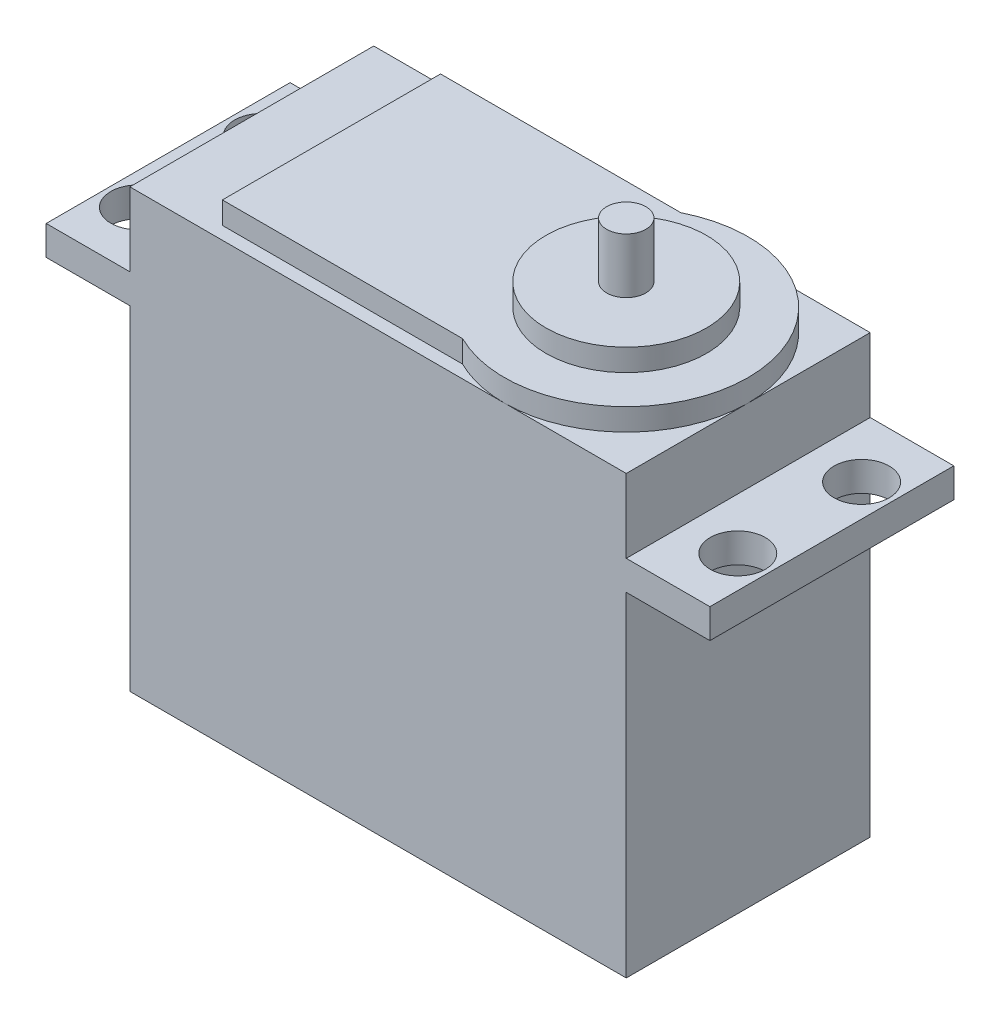
ISO-10303-21;
HEADER;
FILE_DESCRIPTION(('STEP AP214'),'2;1');
FILE_NAME('part.step','',(''),(''),'','','');
FILE_SCHEMA(('AUTOMOTIVE_DESIGN { 1 0 10303 214 1 1 1 1 }'));
ENDSEC;
DATA;
#1=APPLICATION_CONTEXT('core data for automotive mechanical design processes');
#2=APPLICATION_PROTOCOL_DEFINITION('international standard','automotive_design',2000,#1);
#3=PRODUCT_CONTEXT('',#1,'mechanical');
#4=PRODUCT('Part','Part','',(#3));
#5=PRODUCT_RELATED_PRODUCT_CATEGORY('part','',(#4));
#6=PRODUCT_DEFINITION_FORMATION('','',#4);
#7=PRODUCT_DEFINITION_CONTEXT('part definition',#1,'design');
#8=PRODUCT_DEFINITION('design','',#6,#7);
#9=PRODUCT_DEFINITION_SHAPE('','',#8);
#10=(LENGTH_UNIT() NAMED_UNIT(*) SI_UNIT(.MILLI.,.METRE.));
#11=(NAMED_UNIT(*) PLANE_ANGLE_UNIT() SI_UNIT($,.RADIAN.));
#12=(NAMED_UNIT(*) SI_UNIT($,.STERADIAN.) SOLID_ANGLE_UNIT());
#13=UNCERTAINTY_MEASURE_WITH_UNIT(LENGTH_MEASURE(1.E-05),#10,'distance_accuracy_value','');
#14=(GEOMETRIC_REPRESENTATION_CONTEXT(3) GLOBAL_UNCERTAINTY_ASSIGNED_CONTEXT((#13)) GLOBAL_UNIT_ASSIGNED_CONTEXT((#10,
#11,#12)) REPRESENTATION_CONTEXT('',''));
#15=CARTESIAN_POINT('',(0.,0.,0.));
#16=DIRECTION('',(0.,0.,1.));
#17=DIRECTION('',(1.,0.,0.));
#18=AXIS2_PLACEMENT_3D('',#15,#16,#17);
#19=CARTESIAN_POINT('',(0.,36.65,0.));
#20=DIRECTION('',(0.,1.,0.));
#21=DIRECTION('',(0.,0.,1.));
#22=AXIS2_PLACEMENT_3D('',#19,#20,#21);
#23=PLANE('',#22);
#24=DIRECTION('',(1.,0.,0.));
#25=VECTOR('',#24,1.);
#26=CARTESIAN_POINT('',(0.,36.65,8.9));
#27=LINE('',#26,#25);
#28=CARTESIAN_POINT('',(-13.75,36.65,8.9));
#29=VERTEX_POINT('',#28);
#30=CARTESIAN_POINT('',(5.85112373739166,36.65,8.9));
#31=VERTEX_POINT('',#30);
#32=EDGE_CURVE('E205',#29,#31,#27,.T.);
#33=ORIENTED_EDGE('',*,*,#32,.F.);
#34=DIRECTION('',(0.,0.,1.));
#35=VECTOR('',#34,1.);
#36=CARTESIAN_POINT('',(-13.75,36.65,0.));
#37=LINE('',#36,#35);
#38=CARTESIAN_POINT('',(-13.75,36.65,-8.9));
#39=VERTEX_POINT('',#38);
#40=EDGE_CURVE('E202',#39,#29,#37,.T.);
#41=ORIENTED_EDGE('',*,*,#40,.F.);
#42=DIRECTION('',(1.,0.,0.));
#43=VECTOR('',#42,1.);
#44=CARTESIAN_POINT('',(0.,36.65,-8.9));
#45=LINE('',#44,#43);
#46=CARTESIAN_POINT('',(5.85112373739166,36.65,-8.9));
#47=VERTEX_POINT('',#46);
#48=EDGE_CURVE('E367',#39,#47,#45,.T.);
#49=ORIENTED_EDGE('',*,*,#48,.T.);
#50=CARTESIAN_POINT('',(10.3,36.65,0.));
#51=DIRECTION('',(0.,1.,0.));
#52=DIRECTION('',(0.,0.,1.));
#53=AXIS2_PLACEMENT_3D('',#50,#51,#52);
#54=CIRCLE('',#53,9.95);
#55=CARTESIAN_POINT('',(10.3,36.65,-9.95));
#56=VERTEX_POINT('',#55);
#57=EDGE_CURVE('E294',#56,#47,#54,.T.);
#58=ORIENTED_EDGE('',*,*,#57,.F.);
#59=DIRECTION('',(-1.,0.,0.));
#60=VECTOR('',#59,1.);
#61=CARTESIAN_POINT('',(0.,36.65,-9.95));
#62=LINE('',#61,#60);
#63=CARTESIAN_POINT('',(-20.25,36.65,-9.95));
#64=VERTEX_POINT('',#63);
#65=EDGE_CURVE('E219',#56,#64,#62,.T.);
#66=ORIENTED_EDGE('',*,*,#65,.T.);
#67=DIRECTION('',(0.,0.,1.));
#68=VECTOR('',#67,1.);
#69=CARTESIAN_POINT('',(-20.25,36.65,0.));
#70=LINE('',#69,#68);
#71=CARTESIAN_POINT('',(-20.25,36.65,9.95));
#72=VERTEX_POINT('',#71);
#73=EDGE_CURVE('E218',#64,#72,#70,.T.);
#74=ORIENTED_EDGE('',*,*,#73,.T.);
#75=DIRECTION('',(1.,0.,0.));
#76=VECTOR('',#75,1.);
#77=CARTESIAN_POINT('',(0.,36.65,9.95));
#78=LINE('',#77,#76);
#79=CARTESIAN_POINT('',(10.3,36.65,9.95));
#80=VERTEX_POINT('',#79);
#81=EDGE_CURVE('E222',#72,#80,#78,.T.);
#82=ORIENTED_EDGE('',*,*,#81,.T.);
#83=EDGE_CURVE('E365',#31,#80,#54,.T.);
#84=ORIENTED_EDGE('',*,*,#83,.F.);
#85=EDGE_LOOP('',(#33,#41,#49,#58,#66,#74,#82,#84));
#86=FACE_BOUND('',#85,.T.);
#87=ADVANCED_FACE('F43',(#86),#23,.T.);
#88=CARTESIAN_POINT('',(20.25,36.65,0.));
#89=VERTEX_POINT('',#88);
#90=EDGE_CURVE('E355',#80,#89,#54,.T.);
#91=ORIENTED_EDGE('',*,*,#90,.F.);
#92=CARTESIAN_POINT('',(20.25,36.65,9.95));
#93=VERTEX_POINT('',#92);
#94=EDGE_CURVE('E221',#80,#93,#78,.T.);
#95=ORIENTED_EDGE('',*,*,#94,.T.);
#96=DIRECTION('',(0.,0.,-1.));
#97=VECTOR('',#96,1.);
#98=CARTESIAN_POINT('',(20.25,36.65,0.));
#99=LINE('',#98,#97);
#100=EDGE_CURVE('E226',#93,#89,#99,.T.);
#101=ORIENTED_EDGE('',*,*,#100,.T.);
#102=EDGE_LOOP('',(#91,#95,#101));
#103=FACE_BOUND('',#102,.T.);
#104=ADVANCED_FACE('F384',(#103),#23,.T.);
#105=CARTESIAN_POINT('',(0.,30.65,0.));
#106=DIRECTION('',(0.,-1.,0.));
#107=DIRECTION('',(0.,0.,-1.));
#108=AXIS2_PLACEMENT_3D('',#105,#106,#107);
#109=PLANE('',#108);
#110=CARTESIAN_POINT('',(24.45,30.65,-5.05));
#111=DIRECTION('',(0.,1.,0.));
#112=DIRECTION('',(0.,0.,1.));
#113=AXIS2_PLACEMENT_3D('',#110,#111,#112);
#114=CIRCLE('',#113,2.25);
#115=CARTESIAN_POINT('',(24.45,30.65,-2.8));
#116=VERTEX_POINT('',#115);
#117=EDGE_CURVE('E344',#116,#116,#114,.T.);
#118=ORIENTED_EDGE('',*,*,#117,.F.);
#119=EDGE_LOOP('',(#118));
#120=FACE_BOUND('',#119,.T.);
#121=CARTESIAN_POINT('',(24.45,30.65,5.05));
#122=DIRECTION('',(0.,1.,0.));
#123=DIRECTION('',(0.,0.,1.));
#124=AXIS2_PLACEMENT_3D('',#121,#122,#123);
#125=CIRCLE('',#124,2.25);
#126=CARTESIAN_POINT('',(24.45,30.65,7.3));
#127=VERTEX_POINT('',#126);
#128=EDGE_CURVE('E299',#127,#127,#125,.T.);
#129=ORIENTED_EDGE('',*,*,#128,.F.);
#130=EDGE_LOOP('',(#129));
#131=FACE_BOUND('',#130,.T.);
#132=DIRECTION('',(0.,0.,-1.));
#133=VECTOR('',#132,1.);
#134=CARTESIAN_POINT('',(20.25,30.65,0.));
#135=LINE('',#134,#133);
#136=CARTESIAN_POINT('',(20.25,30.65,9.95));
#137=VERTEX_POINT('',#136);
#138=CARTESIAN_POINT('',(20.25,30.65,-9.95));
#139=VERTEX_POINT('',#138);
#140=EDGE_CURVE('E209',#137,#139,#135,.T.);
#141=ORIENTED_EDGE('',*,*,#140,.F.);
#142=DIRECTION('',(1.,0.,0.));
#143=VECTOR('',#142,1.);
#144=CARTESIAN_POINT('',(-27.075,30.65,9.95));
#145=LINE('',#144,#143);
#146=CARTESIAN_POINT('',(27.075,30.65,9.95));
#147=VERTEX_POINT('',#146);
#148=EDGE_CURVE('E253',#137,#147,#145,.T.);
#149=ORIENTED_EDGE('',*,*,#148,.T.);
#150=DIRECTION('',(0.,0.,-1.));
#151=VECTOR('',#150,1.);
#152=CARTESIAN_POINT('',(27.075,30.65,9.95));
#153=LINE('',#152,#151);
#154=CARTESIAN_POINT('',(27.075,30.65,-9.95));
#155=VERTEX_POINT('',#154);
#156=EDGE_CURVE('E244',#147,#155,#153,.T.);
#157=ORIENTED_EDGE('',*,*,#156,.T.);
#158=DIRECTION('',(-1.,0.,0.));
#159=VECTOR('',#158,1.);
#160=CARTESIAN_POINT('',(-27.075,30.65,-9.95));
#161=LINE('',#160,#159);
#162=EDGE_CURVE('E249',#155,#139,#161,.T.);
#163=ORIENTED_EDGE('',*,*,#162,.T.);
#164=EDGE_LOOP('',(#141,#149,#157,#163));
#165=FACE_BOUND('',#164,.T.);
#166=ADVANCED_FACE('F430',(#120,#131,#165),#109,.F.);
#167=CARTESIAN_POINT('',(-24.45,30.65,5.05));
#168=DIRECTION('',(0.,1.,0.));
#169=DIRECTION('',(0.,0.,1.));
#170=AXIS2_PLACEMENT_3D('',#167,#168,#169);
#171=CIRCLE('',#170,2.25);
#172=CARTESIAN_POINT('',(-24.45,30.65,7.3));
#173=VERTEX_POINT('',#172);
#174=EDGE_CURVE('E333',#173,#173,#171,.T.);
#175=ORIENTED_EDGE('',*,*,#174,.F.);
#176=EDGE_LOOP('',(#175));
#177=FACE_BOUND('',#176,.T.);
#178=CARTESIAN_POINT('',(-24.45,30.65,-5.05));
#179=DIRECTION('',(0.,1.,0.));
#180=DIRECTION('',(0.,0.,1.));
#181=AXIS2_PLACEMENT_3D('',#178,#179,#180);
#182=CIRCLE('',#181,2.25);
#183=CARTESIAN_POINT('',(-24.45,30.65,-2.8));
#184=VERTEX_POINT('',#183);
#185=EDGE_CURVE('E339',#184,#184,#182,.T.);
#186=ORIENTED_EDGE('',*,*,#185,.F.);
#187=EDGE_LOOP('',(#186));
#188=FACE_BOUND('',#187,.T.);
#189=DIRECTION('',(0.,0.,1.));
#190=VECTOR('',#189,1.);
#191=CARTESIAN_POINT('',(-20.25,30.65,0.));
#192=LINE('',#191,#190);
#193=CARTESIAN_POINT('',(-20.25,30.65,-9.95));
#194=VERTEX_POINT('',#193);
#195=CARTESIAN_POINT('',(-20.25,30.65,9.95));
#196=VERTEX_POINT('',#195);
#197=EDGE_CURVE('E206',#194,#196,#192,.T.);
#198=ORIENTED_EDGE('',*,*,#197,.F.);
#199=CARTESIAN_POINT('',(-27.075,30.65,-9.95));
#200=VERTEX_POINT('',#199);
#201=EDGE_CURVE('E247',#194,#200,#161,.T.);
#202=ORIENTED_EDGE('',*,*,#201,.T.);
#203=DIRECTION('',(0.,0.,1.));
#204=VECTOR('',#203,1.);
#205=CARTESIAN_POINT('',(-27.075,30.65,9.95));
#206=LINE('',#205,#204);
#207=CARTESIAN_POINT('',(-27.075,30.65,9.95));
#208=VERTEX_POINT('',#207);
#209=EDGE_CURVE('E251',#200,#208,#206,.T.);
#210=ORIENTED_EDGE('',*,*,#209,.T.);
#211=EDGE_CURVE('E254',#208,#196,#145,.T.);
#212=ORIENTED_EDGE('',*,*,#211,.T.);
#213=EDGE_LOOP('',(#198,#202,#210,#212));
#214=FACE_BOUND('',#213,.T.);
#215=ADVANCED_FACE('F399',(#177,#188,#214),#109,.F.);
#216=CARTESIAN_POINT('',(20.25,28.25,9.95));
#217=DIRECTION('',(-1.,0.,0.));
#218=DIRECTION('',(0.,0.,1.));
#219=AXIS2_PLACEMENT_3D('',#216,#217,#218);
#220=PLANE('',#219);
#221=DIRECTION('',(0.,-1.,0.));
#222=VECTOR('',#221,1.);
#223=CARTESIAN_POINT('',(20.25,28.25,9.95));
#224=LINE('',#223,#222);
#225=CARTESIAN_POINT('',(20.25,28.25,9.95));
#226=VERTEX_POINT('',#225);
#227=CARTESIAN_POINT('',(20.25,1.,9.95));
#228=VERTEX_POINT('',#227);
#229=EDGE_CURVE('E285',#226,#228,#224,.T.);
#230=ORIENTED_EDGE('',*,*,#229,.T.);
#231=DIRECTION('',(0.,0.,-1.));
#232=VECTOR('',#231,1.);
#233=CARTESIAN_POINT('',(20.25,1.,-9.95));
#234=LINE('',#233,#232);
#235=CARTESIAN_POINT('',(20.25,1.,-9.95));
#236=VERTEX_POINT('',#235);
#237=EDGE_CURVE('E11',#228,#236,#234,.T.);
#238=ORIENTED_EDGE('',*,*,#237,.T.);
#239=DIRECTION('',(0.,-1.,0.));
#240=VECTOR('',#239,1.);
#241=CARTESIAN_POINT('',(20.25,28.25,-9.95));
#242=LINE('',#241,#240);
#243=CARTESIAN_POINT('',(20.25,28.25,-9.95));
#244=VERTEX_POINT('',#243);
#245=EDGE_CURVE('E291',#244,#236,#242,.T.);
#246=ORIENTED_EDGE('',*,*,#245,.F.);
#247=DIRECTION('',(0.,0.,-1.));
#248=VECTOR('',#247,1.);
#249=CARTESIAN_POINT('',(20.25,28.25,9.95));
#250=LINE('',#249,#248);
#251=EDGE_CURVE('E279',#226,#244,#250,.T.);
#252=ORIENTED_EDGE('',*,*,#251,.F.);
#253=EDGE_LOOP('',(#230,#238,#246,#252));
#254=FACE_BOUND('',#253,.T.);
#255=ADVANCED_FACE('F416',(#254),#220,.F.);
#256=CARTESIAN_POINT('',(-20.25,28.25,-9.95));
#257=DIRECTION('',(0.,0.,1.));
#258=DIRECTION('',(1.,0.,0.));
#259=AXIS2_PLACEMENT_3D('',#256,#257,#258);
#260=PLANE('',#259);
#261=ORIENTED_EDGE('',*,*,#245,.T.);
#262=DIRECTION('',(-1.,0.,0.));
#263=VECTOR('',#262,1.);
#264=CARTESIAN_POINT('',(-20.25,1.,-9.95));
#265=LINE('',#264,#263);
#266=CARTESIAN_POINT('',(-20.25,1.,-9.95));
#267=VERTEX_POINT('',#266);
#268=EDGE_CURVE('E309',#236,#267,#265,.T.);
#269=ORIENTED_EDGE('',*,*,#268,.T.);
#270=DIRECTION('',(0.,-1.,0.));
#271=VECTOR('',#270,1.);
#272=CARTESIAN_POINT('',(-20.25,28.25,-9.95));
#273=LINE('',#272,#271);
#274=CARTESIAN_POINT('',(-20.25,28.25,-9.95));
#275=VERTEX_POINT('',#274);
#276=EDGE_CURVE('E289',#275,#267,#273,.T.);
#277=ORIENTED_EDGE('',*,*,#276,.F.);
#278=DIRECTION('',(-1.,0.,0.));
#279=VECTOR('',#278,1.);
#280=CARTESIAN_POINT('',(-27.075,28.25,-9.95));
#281=LINE('',#280,#279);
#282=CARTESIAN_POINT('',(-27.075,28.25,-9.95));
#283=VERTEX_POINT('',#282);
#284=EDGE_CURVE('E259',#275,#283,#281,.T.);
#285=ORIENTED_EDGE('',*,*,#284,.T.);
#286=DIRECTION('',(0.,-1.,0.));
#287=VECTOR('',#286,1.);
#288=CARTESIAN_POINT('',(-27.075,30.65,-9.95));
#289=LINE('',#288,#287);
#290=EDGE_CURVE('E273',#200,#283,#289,.T.);
#291=ORIENTED_EDGE('',*,*,#290,.F.);
#292=ORIENTED_EDGE('',*,*,#201,.F.);
#293=DIRECTION('',(0.,-1.,0.));
#294=VECTOR('',#293,1.);
#295=CARTESIAN_POINT('',(-20.25,36.65,-9.95));
#296=LINE('',#295,#294);
#297=EDGE_CURVE('E240',#64,#194,#296,.T.);
#298=ORIENTED_EDGE('',*,*,#297,.F.);
#299=ORIENTED_EDGE('',*,*,#65,.F.);
#300=CARTESIAN_POINT('',(20.25,36.65,-9.95));
#301=VERTEX_POINT('',#300);
#302=EDGE_CURVE('E215',#301,#56,#62,.T.);
#303=ORIENTED_EDGE('',*,*,#302,.F.);
#304=DIRECTION('',(0.,-1.,0.));
#305=VECTOR('',#304,1.);
#306=CARTESIAN_POINT('',(20.25,36.65,-9.95));
#307=LINE('',#306,#305);
#308=EDGE_CURVE('E228',#301,#139,#307,.T.);
#309=ORIENTED_EDGE('',*,*,#308,.T.);
#310=ORIENTED_EDGE('',*,*,#162,.F.);
#311=DIRECTION('',(0.,-1.,0.));
#312=VECTOR('',#311,1.);
#313=CARTESIAN_POINT('',(27.075,30.65,-9.95));
#314=LINE('',#313,#312);
#315=CARTESIAN_POINT('',(27.075,28.25,-9.95));
#316=VERTEX_POINT('',#315);
#317=EDGE_CURVE('E276',#155,#316,#314,.T.);
#318=ORIENTED_EDGE('',*,*,#317,.T.);
#319=EDGE_CURVE('E260',#316,#244,#281,.T.);
#320=ORIENTED_EDGE('',*,*,#319,.T.);
#321=EDGE_LOOP('',(#261,#269,#277,#285,#291,#292,#298,#299,#303,#309,#310,#318,#320));
#322=FACE_BOUND('',#321,.T.);
#323=ADVANCED_FACE('F419',(#322),#260,.F.);
#324=CARTESIAN_POINT('',(-20.25,28.25,9.95));
#325=DIRECTION('',(1.,0.,0.));
#326=DIRECTION('',(0.,0.,-1.));
#327=AXIS2_PLACEMENT_3D('',#324,#325,#326);
#328=PLANE('',#327);
#329=ORIENTED_EDGE('',*,*,#276,.T.);
#330=DIRECTION('',(0.,0.,1.));
#331=VECTOR('',#330,1.);
#332=CARTESIAN_POINT('',(-20.25,1.,9.95));
#333=LINE('',#332,#331);
#334=CARTESIAN_POINT('',(-20.25,1.,9.95));
#335=VERTEX_POINT('',#334);
#336=EDGE_CURVE('E68',#267,#335,#333,.T.);
#337=ORIENTED_EDGE('',*,*,#336,.T.);
#338=DIRECTION('',(0.,-1.,0.));
#339=VECTOR('',#338,1.);
#340=CARTESIAN_POINT('',(-20.25,28.25,9.95));
#341=LINE('',#340,#339);
#342=CARTESIAN_POINT('',(-20.25,28.25,9.95));
#343=VERTEX_POINT('',#342);
#344=EDGE_CURVE('E287',#343,#335,#341,.T.);
#345=ORIENTED_EDGE('',*,*,#344,.F.);
#346=DIRECTION('',(0.,0.,1.));
#347=VECTOR('',#346,1.);
#348=CARTESIAN_POINT('',(-20.25,28.25,9.95));
#349=LINE('',#348,#347);
#350=EDGE_CURVE('E282',#275,#343,#349,.T.);
#351=ORIENTED_EDGE('',*,*,#350,.F.);
#352=EDGE_LOOP('',(#329,#337,#345,#351));
#353=FACE_BOUND('',#352,.T.);
#354=ADVANCED_FACE('F438',(#353),#328,.F.);
#355=CARTESIAN_POINT('',(-20.25,28.25,9.95));
#356=DIRECTION('',(0.,0.,-1.));
#357=DIRECTION('',(-1.,0.,0.));
#358=AXIS2_PLACEMENT_3D('',#355,#356,#357);
#359=PLANE('',#358);
#360=ORIENTED_EDGE('',*,*,#344,.T.);
#361=DIRECTION('',(1.,0.,0.));
#362=VECTOR('',#361,1.);
#363=CARTESIAN_POINT('',(20.25,1.,9.95));
#364=LINE('',#363,#362);
#365=EDGE_CURVE('E53',#335,#228,#364,.T.);
#366=ORIENTED_EDGE('',*,*,#365,.T.);
#367=ORIENTED_EDGE('',*,*,#229,.F.);
#368=DIRECTION('',(1.,0.,0.));
#369=VECTOR('',#368,1.);
#370=CARTESIAN_POINT('',(-27.075,28.25,9.95));
#371=LINE('',#370,#369);
#372=CARTESIAN_POINT('',(27.075,28.25,9.95));
#373=VERTEX_POINT('',#372);
#374=EDGE_CURVE('E265',#226,#373,#371,.T.);
#375=ORIENTED_EDGE('',*,*,#374,.T.);
#376=DIRECTION('',(0.,-1.,0.));
#377=VECTOR('',#376,1.);
#378=CARTESIAN_POINT('',(27.075,30.65,9.95));
#379=LINE('',#378,#377);
#380=EDGE_CURVE('E256',#147,#373,#379,.T.);
#381=ORIENTED_EDGE('',*,*,#380,.F.);
#382=ORIENTED_EDGE('',*,*,#148,.F.);
#383=DIRECTION('',(0.,-1.,0.));
#384=VECTOR('',#383,1.);
#385=CARTESIAN_POINT('',(20.25,36.65,9.95));
#386=LINE('',#385,#384);
#387=EDGE_CURVE('E234',#93,#137,#386,.T.);
#388=ORIENTED_EDGE('',*,*,#387,.F.);
#389=ORIENTED_EDGE('',*,*,#94,.F.);
#390=ORIENTED_EDGE('',*,*,#81,.F.);
#391=DIRECTION('',(0.,-1.,0.));
#392=VECTOR('',#391,1.);
#393=CARTESIAN_POINT('',(-20.25,36.65,9.95));
#394=LINE('',#393,#392);
#395=EDGE_CURVE('E237',#72,#196,#394,.T.);
#396=ORIENTED_EDGE('',*,*,#395,.T.);
#397=ORIENTED_EDGE('',*,*,#211,.F.);
#398=DIRECTION('',(0.,-1.,0.));
#399=VECTOR('',#398,1.);
#400=CARTESIAN_POINT('',(-27.075,30.65,9.95));
#401=LINE('',#400,#399);
#402=CARTESIAN_POINT('',(-27.075,28.25,9.95));
#403=VERTEX_POINT('',#402);
#404=EDGE_CURVE('E270',#208,#403,#401,.T.);
#405=ORIENTED_EDGE('',*,*,#404,.T.);
#406=EDGE_CURVE('E248',#403,#343,#371,.T.);
#407=ORIENTED_EDGE('',*,*,#406,.T.);
#408=EDGE_LOOP('',(#360,#366,#367,#375,#381,#382,#388,#389,#390,#396,#397,#405,#407));
#409=FACE_BOUND('',#408,.T.);
#410=ADVANCED_FACE('F388',(#409),#359,.F.);
#411=CARTESIAN_POINT('',(0.,0.,0.));
#412=DIRECTION('',(0.,-1.,0.));
#413=DIRECTION('',(0.,0.,-1.));
#414=AXIS2_PLACEMENT_3D('',#411,#412,#413);
#415=PLANE('',#414);
#416=DIRECTION('',(0.,0.,-1.));
#417=VECTOR('',#416,1.);
#418=CARTESIAN_POINT('',(-19.25,0.,-9.95));
#419=LINE('',#418,#417);
#420=CARTESIAN_POINT('',(-19.25,0.,8.94999999999998));
#421=VERTEX_POINT('',#420);
#422=CARTESIAN_POINT('',(-19.25,0.,-8.94999999999998));
#423=VERTEX_POINT('',#422);
#424=EDGE_CURVE('E317',#421,#423,#419,.T.);
#425=ORIENTED_EDGE('',*,*,#424,.T.);
#426=DIRECTION('',(1.,0.,0.));
#427=VECTOR('',#426,1.);
#428=CARTESIAN_POINT('',(20.25,0.,-8.94999999999998));
#429=LINE('',#428,#427);
#430=CARTESIAN_POINT('',(19.25,0.,-8.94999999999998));
#431=VERTEX_POINT('',#430);
#432=EDGE_CURVE('E319',#423,#431,#429,.T.);
#433=ORIENTED_EDGE('',*,*,#432,.T.);
#434=DIRECTION('',(0.,0.,1.));
#435=VECTOR('',#434,1.);
#436=CARTESIAN_POINT('',(19.25,0.,9.95));
#437=LINE('',#436,#435);
#438=CARTESIAN_POINT('',(19.25,0.,8.94999999999998));
#439=VERTEX_POINT('',#438);
#440=EDGE_CURVE('E312',#431,#439,#437,.T.);
#441=ORIENTED_EDGE('',*,*,#440,.T.);
#442=DIRECTION('',(-1.,0.,0.));
#443=VECTOR('',#442,1.);
#444=CARTESIAN_POINT('',(-20.25,0.,8.94999999999998));
#445=LINE('',#444,#443);
#446=EDGE_CURVE('E315',#439,#421,#445,.T.);
#447=ORIENTED_EDGE('',*,*,#446,.T.);
#448=EDGE_LOOP('',(#425,#433,#441,#447));
#449=FACE_BOUND('',#448,.T.);
#450=ADVANCED_FACE('F445',(#449),#415,.T.);
#451=CARTESIAN_POINT('',(0.,28.25,0.));
#452=DIRECTION('',(0.,-1.,0.));
#453=DIRECTION('',(0.,0.,-1.));
#454=AXIS2_PLACEMENT_3D('',#451,#452,#453);
#455=PLANE('',#454);
#456=CARTESIAN_POINT('',(24.45,28.25,-5.05));
#457=DIRECTION('',(0.,-1.,0.));
#458=DIRECTION('',(0.,0.,-1.));
#459=AXIS2_PLACEMENT_3D('',#456,#457,#458);
#460=CIRCLE('',#459,2.25);
#461=CARTESIAN_POINT('',(24.45,28.25,-7.3));
#462=VERTEX_POINT('',#461);
#463=EDGE_CURVE('E305',#462,#462,#460,.T.);
#464=ORIENTED_EDGE('',*,*,#463,.F.);
#465=EDGE_LOOP('',(#464));
#466=FACE_BOUND('',#465,.T.);
#467=CARTESIAN_POINT('',(24.45,28.25,5.05));
#468=DIRECTION('',(0.,-1.,0.));
#469=DIRECTION('',(0.,0.,-1.));
#470=AXIS2_PLACEMENT_3D('',#467,#468,#469);
#471=CIRCLE('',#470,2.25);
#472=CARTESIAN_POINT('',(24.45,28.25,2.8));
#473=VERTEX_POINT('',#472);
#474=EDGE_CURVE('E302',#473,#473,#471,.T.);
#475=ORIENTED_EDGE('',*,*,#474,.F.);
#476=EDGE_LOOP('',(#475));
#477=FACE_BOUND('',#476,.T.);
#478=ORIENTED_EDGE('',*,*,#374,.F.);
#479=ORIENTED_EDGE('',*,*,#251,.T.);
#480=ORIENTED_EDGE('',*,*,#319,.F.);
#481=DIRECTION('',(0.,0.,-1.));
#482=VECTOR('',#481,1.);
#483=CARTESIAN_POINT('',(27.075,28.25,9.95));
#484=LINE('',#483,#482);
#485=EDGE_CURVE('E243',#373,#316,#484,.T.);
#486=ORIENTED_EDGE('',*,*,#485,.F.);
#487=EDGE_LOOP('',(#478,#479,#480,#486));
#488=FACE_BOUND('',#487,.T.);
#489=ADVANCED_FACE('F424',(#466,#477,#488),#455,.T.);
#490=CARTESIAN_POINT('',(27.075,30.65,9.95));
#491=DIRECTION('',(-1.,0.,0.));
#492=DIRECTION('',(0.,0.,1.));
#493=AXIS2_PLACEMENT_3D('',#490,#491,#492);
#494=PLANE('',#493);
#495=ORIENTED_EDGE('',*,*,#485,.T.);
#496=ORIENTED_EDGE('',*,*,#317,.F.);
#497=ORIENTED_EDGE('',*,*,#156,.F.);
#498=ORIENTED_EDGE('',*,*,#380,.T.);
#499=EDGE_LOOP('',(#495,#496,#497,#498));
#500=FACE_BOUND('',#499,.T.);
#501=ADVANCED_FACE('F428',(#500),#494,.F.);
#502=CARTESIAN_POINT('',(-27.075,30.65,9.95));
#503=DIRECTION('',(1.,0.,0.));
#504=DIRECTION('',(0.,0.,-1.));
#505=AXIS2_PLACEMENT_3D('',#502,#503,#504);
#506=PLANE('',#505);
#507=DIRECTION('',(0.,0.,1.));
#508=VECTOR('',#507,1.);
#509=CARTESIAN_POINT('',(-27.075,28.25,9.95));
#510=LINE('',#509,#508);
#511=EDGE_CURVE('E263',#283,#403,#510,.T.);
#512=ORIENTED_EDGE('',*,*,#511,.T.);
#513=ORIENTED_EDGE('',*,*,#404,.F.);
#514=ORIENTED_EDGE('',*,*,#209,.F.);
#515=ORIENTED_EDGE('',*,*,#290,.T.);
#516=EDGE_LOOP('',(#512,#513,#514,#515));
#517=FACE_BOUND('',#516,.T.);
#518=ADVANCED_FACE('F404',(#517),#506,.F.);
#519=CARTESIAN_POINT('',(-24.45,28.25,5.05));
#520=DIRECTION('',(0.,-1.,0.));
#521=DIRECTION('',(0.,0.,-1.));
#522=AXIS2_PLACEMENT_3D('',#519,#520,#521);
#523=CIRCLE('',#522,2.25);
#524=CARTESIAN_POINT('',(-24.45,28.25,2.8));
#525=VERTEX_POINT('',#524);
#526=EDGE_CURVE('E298',#525,#525,#523,.T.);
#527=ORIENTED_EDGE('',*,*,#526,.F.);
#528=EDGE_LOOP('',(#527));
#529=FACE_BOUND('',#528,.T.);
#530=CARTESIAN_POINT('',(-24.45,28.25,-5.05));
#531=DIRECTION('',(0.,-1.,0.));
#532=DIRECTION('',(0.,0.,-1.));
#533=AXIS2_PLACEMENT_3D('',#530,#531,#532);
#534=CIRCLE('',#533,2.25);
#535=CARTESIAN_POINT('',(-24.45,28.25,-7.3));
#536=VERTEX_POINT('',#535);
#537=EDGE_CURVE('E295',#536,#536,#534,.T.);
#538=ORIENTED_EDGE('',*,*,#537,.F.);
#539=EDGE_LOOP('',(#538));
#540=FACE_BOUND('',#539,.T.);
#541=ORIENTED_EDGE('',*,*,#284,.F.);
#542=ORIENTED_EDGE('',*,*,#350,.T.);
#543=ORIENTED_EDGE('',*,*,#406,.F.);
#544=ORIENTED_EDGE('',*,*,#511,.F.);
#545=EDGE_LOOP('',(#541,#542,#543,#544));
#546=FACE_BOUND('',#545,.T.);
#547=ADVANCED_FACE('F408',(#529,#540,#546),#455,.T.);
#548=CARTESIAN_POINT('',(-20.25,36.65,0.));
#549=DIRECTION('',(1.,0.,0.));
#550=DIRECTION('',(0.,0.,-1.));
#551=AXIS2_PLACEMENT_3D('',#548,#549,#550);
#552=PLANE('',#551);
#553=ORIENTED_EDGE('',*,*,#197,.T.);
#554=ORIENTED_EDGE('',*,*,#395,.F.);
#555=ORIENTED_EDGE('',*,*,#73,.F.);
#556=ORIENTED_EDGE('',*,*,#297,.T.);
#557=EDGE_LOOP('',(#553,#554,#555,#556));
#558=FACE_BOUND('',#557,.T.);
#559=ADVANCED_FACE('F394',(#558),#552,.F.);
#560=CARTESIAN_POINT('',(20.25,36.65,0.));
#561=DIRECTION('',(-1.,0.,0.));
#562=DIRECTION('',(0.,0.,1.));
#563=AXIS2_PLACEMENT_3D('',#560,#561,#562);
#564=PLANE('',#563);
#565=ORIENTED_EDGE('',*,*,#140,.T.);
#566=ORIENTED_EDGE('',*,*,#308,.F.);
#567=EDGE_CURVE('E225',#89,#301,#99,.T.);
#568=ORIENTED_EDGE('',*,*,#567,.F.);
#569=ORIENTED_EDGE('',*,*,#100,.F.);
#570=ORIENTED_EDGE('',*,*,#387,.T.);
#571=EDGE_LOOP('',(#565,#566,#568,#569,#570));
#572=FACE_BOUND('',#571,.T.);
#573=ADVANCED_FACE('F432',(#572),#564,.F.);
#574=EDGE_CURVE('E381',#89,#56,#54,.T.);
#575=ORIENTED_EDGE('',*,*,#574,.F.);
#576=ORIENTED_EDGE('',*,*,#567,.T.);
#577=ORIENTED_EDGE('',*,*,#302,.T.);
#578=EDGE_LOOP('',(#575,#576,#577));
#579=FACE_BOUND('',#578,.T.);
#580=ADVANCED_FACE('F437',(#579),#23,.T.);
#581=CARTESIAN_POINT('',(0.,38.45,8.9));
#582=DIRECTION('',(0.,0.,-1.));
#583=DIRECTION('',(-1.,0.,0.));
#584=AXIS2_PLACEMENT_3D('',#581,#582,#583);
#585=PLANE('',#584);
#586=ORIENTED_EDGE('',*,*,#32,.T.);
#587=DIRECTION('',(0.,-1.,0.));
#588=VECTOR('',#587,1.);
#589=CARTESIAN_POINT('',(5.85112373739166,38.45,8.9));
#590=LINE('',#589,#588);
#591=CARTESIAN_POINT('',(5.85112373739166,38.45,8.9));
#592=VERTEX_POINT('',#591);
#593=EDGE_CURVE('E184',#592,#31,#590,.T.);
#594=ORIENTED_EDGE('',*,*,#593,.F.);
#595=DIRECTION('',(1.,0.,0.));
#596=VECTOR('',#595,1.);
#597=CARTESIAN_POINT('',(0.,38.45,8.9));
#598=LINE('',#597,#596);
#599=CARTESIAN_POINT('',(-13.75,38.45,8.9));
#600=VERTEX_POINT('',#599);
#601=EDGE_CURVE('E193',#600,#592,#598,.T.);
#602=ORIENTED_EDGE('',*,*,#601,.F.);
#603=DIRECTION('',(0.,-1.,0.));
#604=VECTOR('',#603,1.);
#605=CARTESIAN_POINT('',(-13.75,38.45,8.9));
#606=LINE('',#605,#604);
#607=EDGE_CURVE('E363',#600,#29,#606,.T.);
#608=ORIENTED_EDGE('',*,*,#607,.T.);
#609=EDGE_LOOP('',(#586,#594,#602,#608));
#610=FACE_BOUND('',#609,.T.);
#611=ADVANCED_FACE('F204',(#610),#585,.F.);
#612=CARTESIAN_POINT('',(10.3,38.45,0.));
#613=DIRECTION('',(0.,-1.,0.));
#614=DIRECTION('',(0.,0.,-1.));
#615=AXIS2_PLACEMENT_3D('',#612,#613,#614);
#616=CYLINDRICAL_SURFACE('',#615,9.95);
#617=ORIENTED_EDGE('',*,*,#83,.T.);
#618=ORIENTED_EDGE('',*,*,#90,.T.);
#619=ORIENTED_EDGE('',*,*,#574,.T.);
#620=ORIENTED_EDGE('',*,*,#57,.T.);
#621=DIRECTION('',(0.,-1.,0.));
#622=VECTOR('',#621,1.);
#623=CARTESIAN_POINT('',(5.85112373739166,38.45,-8.9));
#624=LINE('',#623,#622);
#625=CARTESIAN_POINT('',(5.85112373739166,38.45,-8.9));
#626=VERTEX_POINT('',#625);
#627=EDGE_CURVE('E188',#626,#47,#624,.T.);
#628=ORIENTED_EDGE('',*,*,#627,.F.);
#629=CARTESIAN_POINT('',(10.3,38.45,0.));
#630=DIRECTION('',(0.,1.,0.));
#631=DIRECTION('',(0.,0.,1.));
#632=AXIS2_PLACEMENT_3D('',#629,#630,#631);
#633=CIRCLE('',#632,9.95);
#634=EDGE_CURVE('E179',#592,#626,#633,.T.);
#635=ORIENTED_EDGE('',*,*,#634,.F.);
#636=ORIENTED_EDGE('',*,*,#593,.T.);
#637=EDGE_LOOP('',(#617,#618,#619,#620,#628,#635,#636));
#638=FACE_BOUND('',#637,.T.);
#639=ADVANCED_FACE('F182',(#638),#616,.T.);
#640=CARTESIAN_POINT('',(0.,38.45,-8.9));
#641=DIRECTION('',(0.,0.,-1.));
#642=DIRECTION('',(-1.,0.,0.));
#643=AXIS2_PLACEMENT_3D('',#640,#641,#642);
#644=PLANE('',#643);
#645=ORIENTED_EDGE('',*,*,#48,.F.);
#646=DIRECTION('',(0.,-1.,0.));
#647=VECTOR('',#646,1.);
#648=CARTESIAN_POINT('',(-13.75,38.45,-8.9));
#649=LINE('',#648,#647);
#650=CARTESIAN_POINT('',(-13.75,38.45,-8.9));
#651=VERTEX_POINT('',#650);
#652=EDGE_CURVE('E211',#651,#39,#649,.T.);
#653=ORIENTED_EDGE('',*,*,#652,.F.);
#654=DIRECTION('',(1.,0.,0.));
#655=VECTOR('',#654,1.);
#656=CARTESIAN_POINT('',(0.,38.45,-8.9));
#657=LINE('',#656,#655);
#658=EDGE_CURVE('E192',#651,#626,#657,.T.);
#659=ORIENTED_EDGE('',*,*,#658,.T.);
#660=ORIENTED_EDGE('',*,*,#627,.T.);
#661=EDGE_LOOP('',(#645,#653,#659,#660));
#662=FACE_BOUND('',#661,.T.);
#663=ADVANCED_FACE('F376',(#662),#644,.T.);
#664=CARTESIAN_POINT('',(-13.75,38.45,0.));
#665=DIRECTION('',(1.,0.,0.));
#666=DIRECTION('',(0.,0.,-1.));
#667=AXIS2_PLACEMENT_3D('',#664,#665,#666);
#668=PLANE('',#667);
#669=ORIENTED_EDGE('',*,*,#40,.T.);
#670=ORIENTED_EDGE('',*,*,#607,.F.);
#671=DIRECTION('',(0.,0.,1.));
#672=VECTOR('',#671,1.);
#673=CARTESIAN_POINT('',(-13.75,38.45,0.));
#674=LINE('',#673,#672);
#675=EDGE_CURVE('E198',#651,#600,#674,.T.);
#676=ORIENTED_EDGE('',*,*,#675,.F.);
#677=ORIENTED_EDGE('',*,*,#652,.T.);
#678=EDGE_LOOP('',(#669,#670,#676,#677));
#679=FACE_BOUND('',#678,.T.);
#680=ADVANCED_FACE('F374',(#679),#668,.F.);
#681=CARTESIAN_POINT('',(0.,38.45,0.));
#682=DIRECTION('',(0.,1.,0.));
#683=DIRECTION('',(0.,0.,1.));
#684=AXIS2_PLACEMENT_3D('',#681,#682,#683);
#685=PLANE('',#684);
#686=CARTESIAN_POINT('',(10.3,38.45,0.));
#687=DIRECTION('',(0.,1.,0.));
#688=DIRECTION('',(0.,0.,1.));
#689=AXIS2_PLACEMENT_3D('',#686,#687,#688);
#690=CIRCLE('',#689,6.55);
#691=CARTESIAN_POINT('',(10.3,38.45,6.55));
#692=VERTEX_POINT('',#691);
#693=EDGE_CURVE('E352',#692,#692,#690,.T.);
#694=ORIENTED_EDGE('',*,*,#693,.F.);
#695=EDGE_LOOP('',(#694));
#696=FACE_BOUND('',#695,.T.);
#697=ORIENTED_EDGE('',*,*,#601,.T.);
#698=ORIENTED_EDGE('',*,*,#634,.T.);
#699=ORIENTED_EDGE('',*,*,#658,.F.);
#700=ORIENTED_EDGE('',*,*,#675,.T.);
#701=EDGE_LOOP('',(#697,#698,#699,#700));
#702=FACE_BOUND('',#701,.T.);
#703=ADVANCED_FACE('F196',(#696,#702),#685,.T.);
#704=CARTESIAN_POINT('',(10.3,40.25,0.));
#705=DIRECTION('',(0.,-1.,0.));
#706=DIRECTION('',(0.,0.,-1.));
#707=AXIS2_PLACEMENT_3D('',#704,#705,#706);
#708=CYLINDRICAL_SURFACE('',#707,6.55);
#709=CARTESIAN_POINT('',(10.3,40.25,0.));
#710=DIRECTION('',(0.,1.,0.));
#711=DIRECTION('',(0.,0.,1.));
#712=AXIS2_PLACEMENT_3D('',#709,#710,#711);
#713=CIRCLE('',#712,6.55);
#714=CARTESIAN_POINT('',(10.3,40.25,6.55));
#715=VERTEX_POINT('',#714);
#716=EDGE_CURVE('E356',#715,#715,#713,.T.);
#717=ORIENTED_EDGE('',*,*,#716,.F.);
#718=EDGE_LOOP('',(#717));
#719=FACE_BOUND('',#718,.T.);
#720=ORIENTED_EDGE('',*,*,#693,.T.);
#721=EDGE_LOOP('',(#720));
#722=FACE_BOUND('',#721,.T.);
#723=ADVANCED_FACE('F545',(#719,#722),#708,.T.);
#724=CARTESIAN_POINT('',(10.3,40.25,0.));
#725=DIRECTION('',(0.,1.,0.));
#726=DIRECTION('',(0.,0.,1.));
#727=AXIS2_PLACEMENT_3D('',#724,#725,#726);
#728=PLANE('',#727);
#729=CARTESIAN_POINT('',(10.3,40.25,0.));
#730=DIRECTION('',(0.,1.,0.));
#731=DIRECTION('',(0.,0.,1.));
#732=AXIS2_PLACEMENT_3D('',#729,#730,#731);
#733=CIRCLE('',#732,1.6);
#734=CARTESIAN_POINT('',(10.3,40.25,1.6));
#735=VERTEX_POINT('',#734);
#736=EDGE_CURVE('E313',#735,#735,#733,.T.);
#737=ORIENTED_EDGE('',*,*,#736,.F.);
#738=EDGE_LOOP('',(#737));
#739=FACE_BOUND('',#738,.T.);
#740=ORIENTED_EDGE('',*,*,#716,.T.);
#741=EDGE_LOOP('',(#740));
#742=FACE_BOUND('',#741,.T.);
#743=ADVANCED_FACE('F541',(#739,#742),#728,.T.);
#744=CARTESIAN_POINT('',(10.3,44.75,0.));
#745=DIRECTION('',(0.,-1.,0.));
#746=DIRECTION('',(0.,0.,-1.));
#747=AXIS2_PLACEMENT_3D('',#744,#745,#746);
#748=CYLINDRICAL_SURFACE('',#747,1.6);
#749=CARTESIAN_POINT('',(10.3,44.75,0.));
#750=DIRECTION('',(0.,1.,0.));
#751=DIRECTION('',(0.,0.,1.));
#752=AXIS2_PLACEMENT_3D('',#749,#750,#751);
#753=CIRCLE('',#752,1.6);
#754=CARTESIAN_POINT('',(10.3,44.75,1.6));
#755=VERTEX_POINT('',#754);
#756=EDGE_CURVE('E308',#755,#755,#753,.T.);
#757=ORIENTED_EDGE('',*,*,#756,.F.);
#758=EDGE_LOOP('',(#757));
#759=FACE_BOUND('',#758,.T.);
#760=ORIENTED_EDGE('',*,*,#736,.T.);
#761=EDGE_LOOP('',(#760));
#762=FACE_BOUND('',#761,.T.);
#763=ADVANCED_FACE('F530',(#759,#762),#748,.T.);
#764=CARTESIAN_POINT('',(10.3,44.75,0.));
#765=DIRECTION('',(0.,1.,0.));
#766=DIRECTION('',(0.,0.,1.));
#767=AXIS2_PLACEMENT_3D('',#764,#765,#766);
#768=PLANE('',#767);
#769=ORIENTED_EDGE('',*,*,#756,.T.);
#770=EDGE_LOOP('',(#769));
#771=FACE_BOUND('',#770,.T.);
#772=ADVANCED_FACE('F520',(#771),#768,.T.);
#773=CARTESIAN_POINT('',(-24.45,0.,-5.05));
#774=DIRECTION('',(0.,1.,0.));
#775=DIRECTION('',(0.,0.,1.));
#776=AXIS2_PLACEMENT_3D('',#773,#774,#775);
#777=CYLINDRICAL_SURFACE('',#776,2.25);
#778=ORIENTED_EDGE('',*,*,#537,.T.);
#779=EDGE_LOOP('',(#778));
#780=FACE_BOUND('',#779,.T.);
#781=ORIENTED_EDGE('',*,*,#185,.T.);
#782=EDGE_LOOP('',(#781));
#783=FACE_BOUND('',#782,.T.);
#784=ADVANCED_FACE('F517',(#780,#783),#777,.F.);
#785=CARTESIAN_POINT('',(-24.45,0.,5.05));
#786=DIRECTION('',(0.,1.,0.));
#787=DIRECTION('',(0.,0.,1.));
#788=AXIS2_PLACEMENT_3D('',#785,#786,#787);
#789=CYLINDRICAL_SURFACE('',#788,2.25);
#790=ORIENTED_EDGE('',*,*,#526,.T.);
#791=EDGE_LOOP('',(#790));
#792=FACE_BOUND('',#791,.T.);
#793=ORIENTED_EDGE('',*,*,#174,.T.);
#794=EDGE_LOOP('',(#793));
#795=FACE_BOUND('',#794,.T.);
#796=ADVANCED_FACE('F519',(#792,#795),#789,.F.);
#797=CARTESIAN_POINT('',(24.45,0.,5.05));
#798=DIRECTION('',(0.,1.,0.));
#799=DIRECTION('',(0.,0.,1.));
#800=AXIS2_PLACEMENT_3D('',#797,#798,#799);
#801=CYLINDRICAL_SURFACE('',#800,2.25);
#802=ORIENTED_EDGE('',*,*,#474,.T.);
#803=EDGE_LOOP('',(#802));
#804=FACE_BOUND('',#803,.T.);
#805=ORIENTED_EDGE('',*,*,#128,.T.);
#806=EDGE_LOOP('',(#805));
#807=FACE_BOUND('',#806,.T.);
#808=ADVANCED_FACE('F527',(#804,#807),#801,.F.);
#809=CARTESIAN_POINT('',(24.45,0.,-5.05));
#810=DIRECTION('',(0.,1.,0.));
#811=DIRECTION('',(0.,0.,1.));
#812=AXIS2_PLACEMENT_3D('',#809,#810,#811);
#813=CYLINDRICAL_SURFACE('',#812,2.25);
#814=ORIENTED_EDGE('',*,*,#463,.T.);
#815=EDGE_LOOP('',(#814));
#816=FACE_BOUND('',#815,.T.);
#817=ORIENTED_EDGE('',*,*,#117,.T.);
#818=EDGE_LOOP('',(#817));
#819=FACE_BOUND('',#818,.T.);
#820=ADVANCED_FACE('F534',(#816,#819),#813,.F.);
#821=CARTESIAN_POINT('',(-20.25,1.,9.95));
#822=DIRECTION('',(0.,-0.707106781186552,0.707106781186542));
#823=DIRECTION('',(-1.,0.,0.));
#824=AXIS2_PLACEMENT_3D('',#821,#822,#823);
#825=PLANE('',#824);
#826=DIRECTION('',(0.577350269189629,-0.577350269189621,-0.577350269189629));
#827=VECTOR('',#826,1.);
#828=CARTESIAN_POINT('',(-20.25,1.,9.95));
#829=LINE('',#828,#827);
#830=EDGE_CURVE('E327',#421,#335,#829,.F.);
#831=ORIENTED_EDGE('',*,*,#830,.F.);
#832=ORIENTED_EDGE('',*,*,#446,.F.);
#833=DIRECTION('',(-0.577350269189629,-0.577350269189621,-0.577350269189629));
#834=VECTOR('',#833,1.);
#835=CARTESIAN_POINT('',(20.25,1.,9.95));
#836=LINE('',#835,#834);
#837=EDGE_CURVE('E48',#228,#439,#836,.T.);
#838=ORIENTED_EDGE('',*,*,#837,.F.);
#839=ORIENTED_EDGE('',*,*,#365,.F.);
#840=EDGE_LOOP('',(#831,#832,#838,#839));
#841=FACE_BOUND('',#840,.T.);
#842=ADVANCED_FACE('F46',(#841),#825,.T.);
#843=CARTESIAN_POINT('',(20.25,1.,9.95));
#844=DIRECTION('',(0.707106781186542,-0.707106781186552,0.));
#845=DIRECTION('',(0.,0.,1.));
#846=AXIS2_PLACEMENT_3D('',#843,#844,#845);
#847=PLANE('',#846);
#848=ORIENTED_EDGE('',*,*,#837,.T.);
#849=ORIENTED_EDGE('',*,*,#440,.F.);
#850=DIRECTION('',(0.577350269189629,0.577350269189621,-0.577350269189629));
#851=VECTOR('',#850,1.);
#852=CARTESIAN_POINT('',(13.6166666666666,-5.6333333333333,-3.31666666666661));
#853=LINE('',#852,#851);
#854=EDGE_CURVE('E326',#236,#431,#853,.F.);
#855=ORIENTED_EDGE('',*,*,#854,.F.);
#856=ORIENTED_EDGE('',*,*,#237,.F.);
#857=EDGE_LOOP('',(#848,#849,#855,#856));
#858=FACE_BOUND('',#857,.T.);
#859=ADVANCED_FACE('F413',(#858),#847,.T.);
#860=CARTESIAN_POINT('',(-20.25,1.,9.95));
#861=DIRECTION('',(-0.707106781186542,-0.707106781186552,0.));
#862=DIRECTION('',(0.,0.,-1.));
#863=AXIS2_PLACEMENT_3D('',#860,#861,#862);
#864=PLANE('',#863);
#865=ORIENTED_EDGE('',*,*,#830,.T.);
#866=ORIENTED_EDGE('',*,*,#336,.F.);
#867=DIRECTION('',(0.577350269189629,-0.577350269189621,0.577350269189629));
#868=VECTOR('',#867,1.);
#869=CARTESIAN_POINT('',(-13.6166666666666,-5.6333333333333,-3.31666666666661));
#870=LINE('',#869,#868);
#871=EDGE_CURVE('E324',#423,#267,#870,.F.);
#872=ORIENTED_EDGE('',*,*,#871,.F.);
#873=ORIENTED_EDGE('',*,*,#424,.F.);
#874=EDGE_LOOP('',(#865,#866,#872,#873));
#875=FACE_BOUND('',#874,.T.);
#876=ADVANCED_FACE('F486',(#875),#864,.T.);
#877=CARTESIAN_POINT('',(-20.25,1.,-9.95));
#878=DIRECTION('',(0.,-0.707106781186552,-0.707106781186542));
#879=DIRECTION('',(1.,0.,0.));
#880=AXIS2_PLACEMENT_3D('',#877,#878,#879);
#881=PLANE('',#880);
#882=ORIENTED_EDGE('',*,*,#854,.T.);
#883=ORIENTED_EDGE('',*,*,#432,.F.);
#884=ORIENTED_EDGE('',*,*,#871,.T.);
#885=ORIENTED_EDGE('',*,*,#268,.F.);
#886=EDGE_LOOP('',(#882,#883,#884,#885));
#887=FACE_BOUND('',#886,.T.);
#888=ADVANCED_FACE('F485',(#887),#881,.T.);
#889=CLOSED_SHELL('',(#87,#104,#166,#215,#255,#323,#354,#410,#450,#489,#501,#518,#547,#559,#573,
#580,#611,#639,#663,#680,#703,#723,#743,#763,#772,#784,#796,#808,#820,#842,#859,#876,#888));
#890=MANIFOLD_SOLID_BREP('B2',#889);
#891=ADVANCED_BREP_SHAPE_REPRESENTATION('',(#18,#890),#14);
#892=SHAPE_DEFINITION_REPRESENTATION(#9,#891);
ENDSEC;
END-ISO-10303-21;
